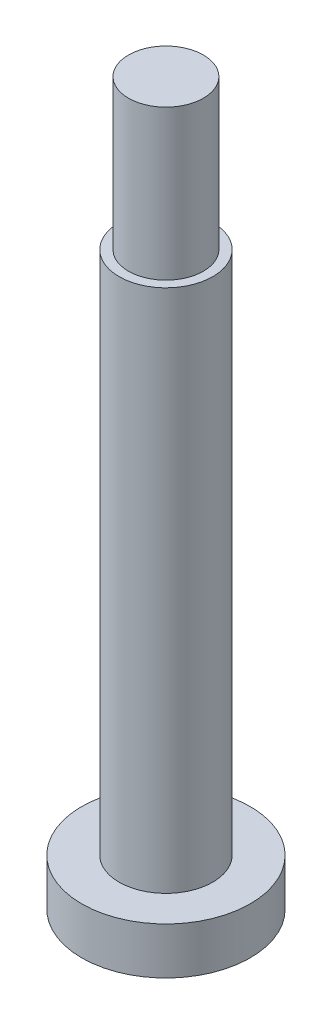
ISO-10303-21;
HEADER;
FILE_DESCRIPTION(('STEP AP214'),'2;1');
FILE_NAME('part.step','',(''),(''),'','','');
FILE_SCHEMA(('AUTOMOTIVE_DESIGN { 1 0 10303 214 1 1 1 1 }'));
ENDSEC;
DATA;
#1=APPLICATION_CONTEXT('core data for automotive mechanical design processes');
#2=APPLICATION_PROTOCOL_DEFINITION('international standard','automotive_design',2000,#1);
#3=PRODUCT_CONTEXT('',#1,'mechanical');
#4=PRODUCT('Part','Part','',(#3));
#5=PRODUCT_RELATED_PRODUCT_CATEGORY('part','',(#4));
#6=PRODUCT_DEFINITION_FORMATION('','',#4);
#7=PRODUCT_DEFINITION_CONTEXT('part definition',#1,'design');
#8=PRODUCT_DEFINITION('design','',#6,#7);
#9=PRODUCT_DEFINITION_SHAPE('','',#8);
#10=(LENGTH_UNIT() NAMED_UNIT(*) SI_UNIT(.MILLI.,.METRE.));
#11=(NAMED_UNIT(*) PLANE_ANGLE_UNIT() SI_UNIT($,.RADIAN.));
#12=(NAMED_UNIT(*) SI_UNIT($,.STERADIAN.) SOLID_ANGLE_UNIT());
#13=UNCERTAINTY_MEASURE_WITH_UNIT(LENGTH_MEASURE(1.E-05),#10,'distance_accuracy_value','');
#14=(GEOMETRIC_REPRESENTATION_CONTEXT(3) GLOBAL_UNCERTAINTY_ASSIGNED_CONTEXT((#13)) GLOBAL_UNIT_ASSIGNED_CONTEXT((#10,
#11,#12)) REPRESENTATION_CONTEXT('',''));
#15=CARTESIAN_POINT('',(0.,0.,0.));
#16=DIRECTION('',(0.,0.,1.));
#17=DIRECTION('',(1.,0.,0.));
#18=AXIS2_PLACEMENT_3D('',#15,#16,#17);
#19=CARTESIAN_POINT('',(0.,2.5,0.));
#20=DIRECTION('',(0.,-1.,0.));
#21=DIRECTION('',(0.,0.,-1.));
#22=AXIS2_PLACEMENT_3D('',#19,#20,#21);
#23=CYLINDRICAL_SURFACE('',#22,4.5);
#24=CARTESIAN_POINT('',(0.,2.5,0.));
#25=DIRECTION('',(0.,1.,0.));
#26=DIRECTION('',(0.,0.,1.));
#27=AXIS2_PLACEMENT_3D('',#24,#25,#26);
#28=CIRCLE('',#27,4.5);
#29=CARTESIAN_POINT('',(0.,2.5,4.5));
#30=VERTEX_POINT('',#29);
#31=EDGE_CURVE('E53',#30,#30,#28,.T.);
#32=ORIENTED_EDGE('',*,*,#31,.F.);
#33=EDGE_LOOP('',(#32));
#34=FACE_BOUND('',#33,.T.);
#35=CARTESIAN_POINT('',(0.,0.,0.));
#36=DIRECTION('',(0.,1.,0.));
#37=DIRECTION('',(0.,0.,1.));
#38=AXIS2_PLACEMENT_3D('',#35,#36,#37);
#39=CIRCLE('',#38,4.5);
#40=CARTESIAN_POINT('',(0.,0.,4.5));
#41=VERTEX_POINT('',#40);
#42=EDGE_CURVE('E44',#41,#41,#39,.T.);
#43=ORIENTED_EDGE('',*,*,#42,.T.);
#44=EDGE_LOOP('',(#43));
#45=FACE_BOUND('',#44,.T.);
#46=ADVANCED_FACE('F41',(#34,#45),#23,.T.);
#47=CARTESIAN_POINT('',(0.,2.5,0.));
#48=DIRECTION('',(0.,1.,0.));
#49=DIRECTION('',(0.,0.,1.));
#50=AXIS2_PLACEMENT_3D('',#47,#48,#49);
#51=PLANE('',#50);
#52=CARTESIAN_POINT('',(0.,2.5,0.));
#53=DIRECTION('',(0.,1.,0.));
#54=DIRECTION('',(0.,0.,1.));
#55=AXIS2_PLACEMENT_3D('',#52,#53,#54);
#56=CIRCLE('',#55,2.5);
#57=CARTESIAN_POINT('',(0.,2.5,2.5));
#58=VERTEX_POINT('',#57);
#59=EDGE_CURVE('E48',#58,#58,#56,.T.);
#60=ORIENTED_EDGE('',*,*,#59,.F.);
#61=EDGE_LOOP('',(#60));
#62=FACE_BOUND('',#61,.T.);
#63=ORIENTED_EDGE('',*,*,#31,.T.);
#64=EDGE_LOOP('',(#63));
#65=FACE_BOUND('',#64,.T.);
#66=ADVANCED_FACE('F70',(#62,#65),#51,.T.);
#67=CARTESIAN_POINT('',(0.,0.,0.));
#68=DIRECTION('',(0.,1.,0.));
#69=DIRECTION('',(0.,0.,1.));
#70=AXIS2_PLACEMENT_3D('',#67,#68,#69);
#71=PLANE('',#70);
#72=ORIENTED_EDGE('',*,*,#42,.F.);
#73=EDGE_LOOP('',(#72));
#74=FACE_BOUND('',#73,.T.);
#75=ADVANCED_FACE('F67',(#74),#71,.F.);
#76=CARTESIAN_POINT('',(0.,30.5,0.));
#77=DIRECTION('',(0.,-1.,0.));
#78=DIRECTION('',(0.,0.,-1.));
#79=AXIS2_PLACEMENT_3D('',#76,#77,#78);
#80=CYLINDRICAL_SURFACE('',#79,2.5);
#81=CARTESIAN_POINT('',(0.,30.5,0.));
#82=DIRECTION('',(0.,1.,0.));
#83=DIRECTION('',(0.,0.,1.));
#84=AXIS2_PLACEMENT_3D('',#81,#82,#83);
#85=CIRCLE('',#84,2.5);
#86=CARTESIAN_POINT('',(0.,30.5,2.5));
#87=VERTEX_POINT('',#86);
#88=EDGE_CURVE('E58',#87,#87,#85,.T.);
#89=ORIENTED_EDGE('',*,*,#88,.F.);
#90=EDGE_LOOP('',(#89));
#91=FACE_BOUND('',#90,.T.);
#92=ORIENTED_EDGE('',*,*,#59,.T.);
#93=EDGE_LOOP('',(#92));
#94=FACE_BOUND('',#93,.T.);
#95=ADVANCED_FACE('F69',(#91,#94),#80,.T.);
#96=CARTESIAN_POINT('',(0.,30.5,0.));
#97=DIRECTION('',(0.,1.,0.));
#98=DIRECTION('',(0.,0.,1.));
#99=AXIS2_PLACEMENT_3D('',#96,#97,#98);
#100=PLANE('',#99);
#101=CARTESIAN_POINT('',(0.,30.5,0.));
#102=DIRECTION('',(0.,1.,0.));
#103=DIRECTION('',(0.,0.,1.));
#104=AXIS2_PLACEMENT_3D('',#101,#102,#103);
#105=CIRCLE('',#104,2.);
#106=CARTESIAN_POINT('',(0.,30.5,2.));
#107=VERTEX_POINT('',#106);
#108=EDGE_CURVE('E10',#107,#107,#105,.T.);
#109=ORIENTED_EDGE('',*,*,#108,.F.);
#110=EDGE_LOOP('',(#109));
#111=FACE_BOUND('',#110,.T.);
#112=ORIENTED_EDGE('',*,*,#88,.T.);
#113=EDGE_LOOP('',(#112));
#114=FACE_BOUND('',#113,.T.);
#115=ADVANCED_FACE('F75',(#111,#114),#100,.T.);
#116=CARTESIAN_POINT('',(0.,38.5,0.));
#117=DIRECTION('',(0.,-1.,0.));
#118=DIRECTION('',(0.,0.,-1.));
#119=AXIS2_PLACEMENT_3D('',#116,#117,#118);
#120=CYLINDRICAL_SURFACE('',#119,2.);
#121=CARTESIAN_POINT('',(0.,38.5,0.));
#122=DIRECTION('',(0.,1.,0.));
#123=DIRECTION('',(0.,0.,1.));
#124=AXIS2_PLACEMENT_3D('',#121,#122,#123);
#125=CIRCLE('',#124,2.);
#126=CARTESIAN_POINT('',(0.,38.5,2.));
#127=VERTEX_POINT('',#126);
#128=EDGE_CURVE('E57',#127,#127,#125,.T.);
#129=ORIENTED_EDGE('',*,*,#128,.F.);
#130=EDGE_LOOP('',(#129));
#131=FACE_BOUND('',#130,.T.);
#132=ORIENTED_EDGE('',*,*,#108,.T.);
#133=EDGE_LOOP('',(#132));
#134=FACE_BOUND('',#133,.T.);
#135=ADVANCED_FACE('F105',(#131,#134),#120,.T.);
#136=CARTESIAN_POINT('',(0.,38.5,0.));
#137=DIRECTION('',(0.,1.,0.));
#138=DIRECTION('',(0.,0.,1.));
#139=AXIS2_PLACEMENT_3D('',#136,#137,#138);
#140=PLANE('',#139);
#141=ORIENTED_EDGE('',*,*,#128,.T.);
#142=EDGE_LOOP('',(#141));
#143=FACE_BOUND('',#142,.T.);
#144=ADVANCED_FACE('F116',(#143),#140,.T.);
#145=CLOSED_SHELL('',(#46,#66,#75,#95,#115,#135,#144));
#146=MANIFOLD_SOLID_BREP('B2',#145);
#147=ADVANCED_BREP_SHAPE_REPRESENTATION('',(#18,#146),#14);
#148=SHAPE_DEFINITION_REPRESENTATION(#9,#147);
ENDSEC;
END-ISO-10303-21;
